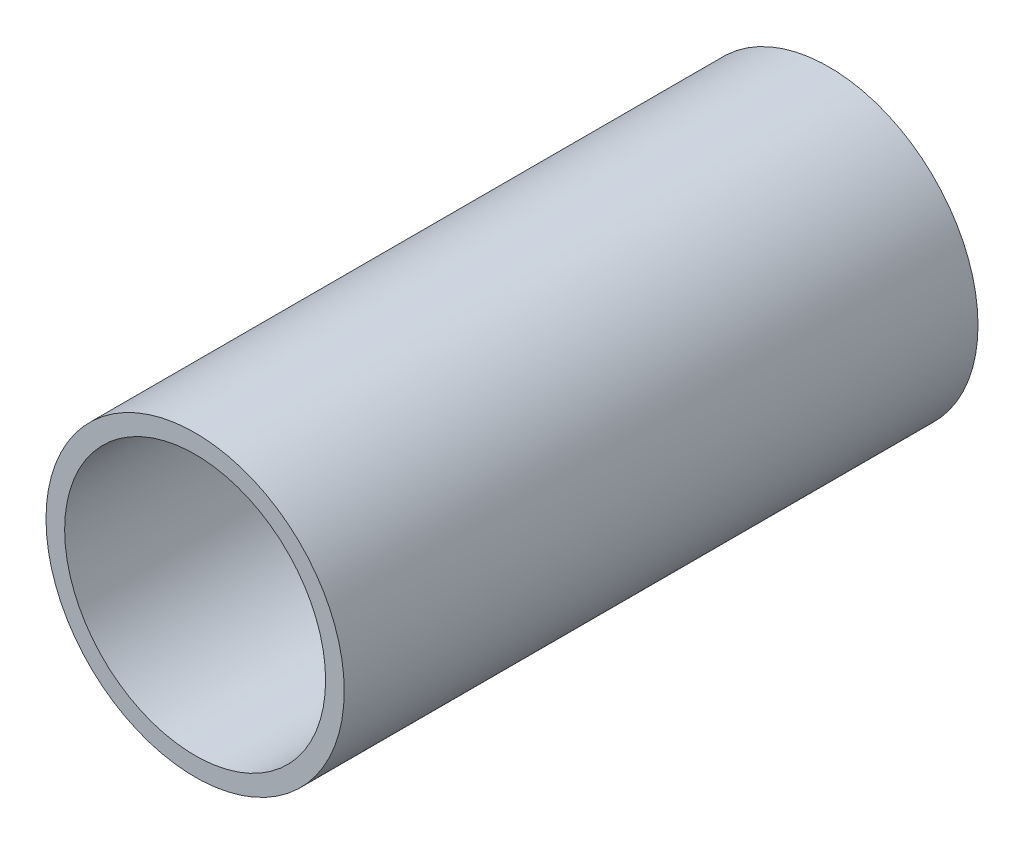
ISO-10303-21;
HEADER;
FILE_DESCRIPTION(('STEP AP214'),'2;1');
FILE_NAME('part.step','',(''),(''),'','','');
FILE_SCHEMA(('AUTOMOTIVE_DESIGN { 1 0 10303 214 1 1 1 1 }'));
ENDSEC;
DATA;
#1=APPLICATION_CONTEXT('core data for automotive mechanical design processes');
#2=APPLICATION_PROTOCOL_DEFINITION('international standard','automotive_design',2000,#1);
#3=PRODUCT_CONTEXT('',#1,'mechanical');
#4=PRODUCT('Part','Part','',(#3));
#5=PRODUCT_RELATED_PRODUCT_CATEGORY('part','',(#4));
#6=PRODUCT_DEFINITION_FORMATION('','',#4);
#7=PRODUCT_DEFINITION_CONTEXT('part definition',#1,'design');
#8=PRODUCT_DEFINITION('design','',#6,#7);
#9=PRODUCT_DEFINITION_SHAPE('','',#8);
#10=(LENGTH_UNIT() NAMED_UNIT(*) SI_UNIT(.MILLI.,.METRE.));
#11=(NAMED_UNIT(*) PLANE_ANGLE_UNIT() SI_UNIT($,.RADIAN.));
#12=(NAMED_UNIT(*) SI_UNIT($,.STERADIAN.) SOLID_ANGLE_UNIT());
#13=UNCERTAINTY_MEASURE_WITH_UNIT(LENGTH_MEASURE(1.E-05),#10,'distance_accuracy_value','');
#14=(GEOMETRIC_REPRESENTATION_CONTEXT(3) GLOBAL_UNCERTAINTY_ASSIGNED_CONTEXT((#13)) GLOBAL_UNIT_ASSIGNED_CONTEXT((#10,
#11,#12)) REPRESENTATION_CONTEXT('',''));
#15=CARTESIAN_POINT('',(0.,0.,0.));
#16=DIRECTION('',(0.,0.,1.));
#17=DIRECTION('',(1.,0.,0.));
#18=AXIS2_PLACEMENT_3D('',#15,#16,#17);
#19=CARTESIAN_POINT('',(0.,0.,17.));
#20=DIRECTION('',(0.,0.,-1.));
#21=DIRECTION('',(-1.,0.,0.));
#22=AXIS2_PLACEMENT_3D('',#19,#20,#21);
#23=CYLINDRICAL_SURFACE('',#22,4.);
#24=CARTESIAN_POINT('',(0.,0.,17.));
#25=DIRECTION('',(0.,0.,1.));
#26=DIRECTION('',(1.,0.,0.));
#27=AXIS2_PLACEMENT_3D('',#24,#25,#26);
#28=CIRCLE('',#27,4.);
#29=CARTESIAN_POINT('',(4.,0.,17.));
#30=VERTEX_POINT('',#29);
#31=EDGE_CURVE('E10',#30,#30,#28,.T.);
#32=ORIENTED_EDGE('',*,*,#31,.F.);
#33=EDGE_LOOP('',(#32));
#34=FACE_BOUND('',#33,.T.);
#35=CARTESIAN_POINT('',(0.,0.,0.));
#36=DIRECTION('',(0.,0.,1.));
#37=DIRECTION('',(1.,0.,0.));
#38=AXIS2_PLACEMENT_3D('',#35,#36,#37);
#39=CIRCLE('',#38,4.);
#40=CARTESIAN_POINT('',(4.,0.,0.));
#41=VERTEX_POINT('',#40);
#42=EDGE_CURVE('E34',#41,#41,#39,.T.);
#43=ORIENTED_EDGE('',*,*,#42,.T.);
#44=EDGE_LOOP('',(#43));
#45=FACE_BOUND('',#44,.T.);
#46=ADVANCED_FACE('F31',(#34,#45),#23,.T.);
#47=CARTESIAN_POINT('',(0.,0.,17.));
#48=DIRECTION('',(0.,0.,1.));
#49=DIRECTION('',(1.,0.,0.));
#50=AXIS2_PLACEMENT_3D('',#47,#48,#49);
#51=PLANE('',#50);
#52=CARTESIAN_POINT('',(0.,0.,17.));
#53=DIRECTION('',(0.,0.,1.));
#54=DIRECTION('',(1.,0.,0.));
#55=AXIS2_PLACEMENT_3D('',#52,#53,#54);
#56=CIRCLE('',#55,3.5);
#57=CARTESIAN_POINT('',(3.5,0.,17.));
#58=VERTEX_POINT('',#57);
#59=EDGE_CURVE('E43',#58,#58,#56,.T.);
#60=ORIENTED_EDGE('',*,*,#59,.F.);
#61=EDGE_LOOP('',(#60));
#62=FACE_BOUND('',#61,.T.);
#63=ORIENTED_EDGE('',*,*,#31,.T.);
#64=EDGE_LOOP('',(#63));
#65=FACE_BOUND('',#64,.T.);
#66=ADVANCED_FACE('F58',(#62,#65),#51,.T.);
#67=CARTESIAN_POINT('',(0.,0.,0.));
#68=DIRECTION('',(0.,0.,1.));
#69=DIRECTION('',(1.,0.,0.));
#70=AXIS2_PLACEMENT_3D('',#67,#68,#69);
#71=PLANE('',#70);
#72=ORIENTED_EDGE('',*,*,#42,.F.);
#73=EDGE_LOOP('',(#72));
#74=FACE_BOUND('',#73,.T.);
#75=ADVANCED_FACE('F54',(#74),#71,.F.);
#76=CARTESIAN_POINT('',(0.,0.,2.));
#77=DIRECTION('',(0.,0.,1.));
#78=DIRECTION('',(1.,0.,0.));
#79=AXIS2_PLACEMENT_3D('',#76,#77,#78);
#80=CYLINDRICAL_SURFACE('',#79,3.5);
#81=CARTESIAN_POINT('',(0.,0.,2.));
#82=DIRECTION('',(0.,0.,1.));
#83=DIRECTION('',(1.,0.,0.));
#84=AXIS2_PLACEMENT_3D('',#81,#82,#83);
#85=CIRCLE('',#84,3.5);
#86=CARTESIAN_POINT('',(3.5,0.,2.));
#87=VERTEX_POINT('',#86);
#88=EDGE_CURVE('E41',#87,#87,#85,.T.);
#89=ORIENTED_EDGE('',*,*,#88,.F.);
#90=EDGE_LOOP('',(#89));
#91=FACE_BOUND('',#90,.T.);
#92=ORIENTED_EDGE('',*,*,#59,.T.);
#93=EDGE_LOOP('',(#92));
#94=FACE_BOUND('',#93,.T.);
#95=ADVANCED_FACE('F51',(#91,#94),#80,.F.);
#96=CARTESIAN_POINT('',(0.,0.,2.));
#97=DIRECTION('',(0.,0.,1.));
#98=DIRECTION('',(1.,0.,0.));
#99=AXIS2_PLACEMENT_3D('',#96,#97,#98);
#100=PLANE('',#99);
#101=ORIENTED_EDGE('',*,*,#88,.T.);
#102=EDGE_LOOP('',(#101));
#103=FACE_BOUND('',#102,.T.);
#104=ADVANCED_FACE('F49',(#103),#100,.T.);
#105=CLOSED_SHELL('',(#46,#66,#75,#95,#104));
#106=MANIFOLD_SOLID_BREP('B2',#105);
#107=ADVANCED_BREP_SHAPE_REPRESENTATION('',(#18,#106),#14);
#108=SHAPE_DEFINITION_REPRESENTATION(#9,#107);
ENDSEC;
END-ISO-10303-21;
